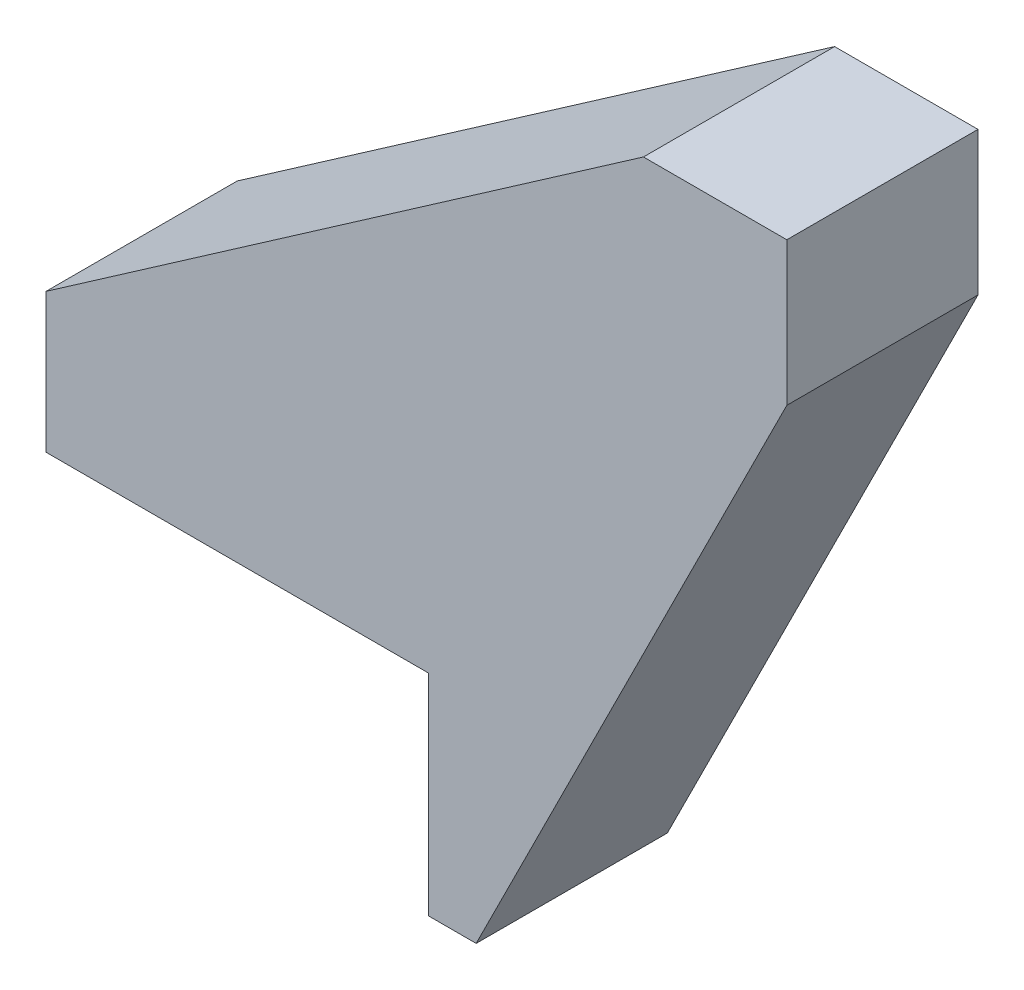
ISO-10303-21;
HEADER;
FILE_DESCRIPTION(('STEP AP214'),'2;1');
FILE_NAME('part.step','',(''),(''),'','','');
FILE_SCHEMA(('AUTOMOTIVE_DESIGN { 1 0 10303 214 1 1 1 1 }'));
ENDSEC;
DATA;
#1=APPLICATION_CONTEXT('core data for automotive mechanical design processes');
#2=APPLICATION_PROTOCOL_DEFINITION('international standard','automotive_design',2000,#1);
#3=PRODUCT_CONTEXT('',#1,'mechanical');
#4=PRODUCT('Part','Part','',(#3));
#5=PRODUCT_RELATED_PRODUCT_CATEGORY('part','',(#4));
#6=PRODUCT_DEFINITION_FORMATION('','',#4);
#7=PRODUCT_DEFINITION_CONTEXT('part definition',#1,'design');
#8=PRODUCT_DEFINITION('design','',#6,#7);
#9=PRODUCT_DEFINITION_SHAPE('','',#8);
#10=(LENGTH_UNIT() NAMED_UNIT(*) SI_UNIT(.MILLI.,.METRE.));
#11=(NAMED_UNIT(*) PLANE_ANGLE_UNIT() SI_UNIT($,.RADIAN.));
#12=(NAMED_UNIT(*) SI_UNIT($,.STERADIAN.) SOLID_ANGLE_UNIT());
#13=UNCERTAINTY_MEASURE_WITH_UNIT(LENGTH_MEASURE(1.E-05),#10,'distance_accuracy_value','');
#14=(GEOMETRIC_REPRESENTATION_CONTEXT(3) GLOBAL_UNCERTAINTY_ASSIGNED_CONTEXT((#13)) GLOBAL_UNIT_ASSIGNED_CONTEXT((#10,
#11,#12)) REPRESENTATION_CONTEXT('',''));
#15=CARTESIAN_POINT('',(0.,0.,0.));
#16=DIRECTION('',(0.,0.,1.));
#17=DIRECTION('',(1.,0.,0.));
#18=AXIS2_PLACEMENT_3D('',#15,#16,#17);
#19=CARTESIAN_POINT('',(-25.4,0.,12.7));
#20=DIRECTION('',(0.,1.,0.));
#21=DIRECTION('',(0.,0.,1.));
#22=AXIS2_PLACEMENT_3D('',#19,#20,#21);
#23=PLANE('',#22);
#24=DIRECTION('',(1.,0.,0.));
#25=VECTOR('',#24,1.);
#26=CARTESIAN_POINT('',(-25.4,0.,0.));
#27=LINE('',#26,#25);
#28=CARTESIAN_POINT('',(-25.4,0.,0.));
#29=VERTEX_POINT('',#28);
#30=CARTESIAN_POINT('',(0.,0.,0.));
#31=VERTEX_POINT('',#30);
#32=EDGE_CURVE('E139',#29,#31,#27,.T.);
#33=ORIENTED_EDGE('',*,*,#32,.T.);
#34=DIRECTION('',(0.,0.,-1.));
#35=VECTOR('',#34,1.);
#36=CARTESIAN_POINT('',(0.,0.,12.7));
#37=LINE('',#36,#35);
#38=CARTESIAN_POINT('',(0.,0.,12.7));
#39=VERTEX_POINT('',#38);
#40=EDGE_CURVE('E11',#39,#31,#37,.T.);
#41=ORIENTED_EDGE('',*,*,#40,.F.);
#42=DIRECTION('',(1.,0.,0.));
#43=VECTOR('',#42,1.);
#44=CARTESIAN_POINT('',(-25.4,0.,12.7));
#45=LINE('',#44,#43);
#46=CARTESIAN_POINT('',(-25.4,0.,12.7));
#47=VERTEX_POINT('',#46);
#48=EDGE_CURVE('E153',#47,#39,#45,.T.);
#49=ORIENTED_EDGE('',*,*,#48,.F.);
#50=DIRECTION('',(0.,0.,-1.));
#51=VECTOR('',#50,1.);
#52=CARTESIAN_POINT('',(-25.4,0.,12.7));
#53=LINE('',#52,#51);
#54=EDGE_CURVE('E135',#47,#29,#53,.T.);
#55=ORIENTED_EDGE('',*,*,#54,.T.);
#56=EDGE_LOOP('',(#33,#41,#49,#55));
#57=FACE_BOUND('',#56,.T.);
#58=ADVANCED_FACE('F43',(#57),#23,.F.);
#59=CARTESIAN_POINT('',(0.,0.,12.7));
#60=DIRECTION('',(1.,0.,0.));
#61=DIRECTION('',(0.,1.,0.));
#62=AXIS2_PLACEMENT_3D('',#59,#60,#61);
#63=PLANE('',#62);
#64=DIRECTION('',(0.,-1.,0.));
#65=VECTOR('',#64,1.);
#66=CARTESIAN_POINT('',(0.,0.,0.));
#67=LINE('',#66,#65);
#68=CARTESIAN_POINT('',(0.,-13.97,0.));
#69=VERTEX_POINT('',#68);
#70=EDGE_CURVE('E142',#31,#69,#67,.T.);
#71=ORIENTED_EDGE('',*,*,#70,.T.);
#72=DIRECTION('',(0.,0.,-1.));
#73=VECTOR('',#72,1.);
#74=CARTESIAN_POINT('',(0.,-13.97,12.7));
#75=LINE('',#74,#73);
#76=CARTESIAN_POINT('',(0.,-13.97,12.7));
#77=VERTEX_POINT('',#76);
#78=EDGE_CURVE('E51',#77,#69,#75,.T.);
#79=ORIENTED_EDGE('',*,*,#78,.F.);
#80=DIRECTION('',(0.,-1.,0.));
#81=VECTOR('',#80,1.);
#82=CARTESIAN_POINT('',(0.,0.,12.7));
#83=LINE('',#82,#81);
#84=EDGE_CURVE('E102',#39,#77,#83,.T.);
#85=ORIENTED_EDGE('',*,*,#84,.F.);
#86=ORIENTED_EDGE('',*,*,#40,.T.);
#87=EDGE_LOOP('',(#71,#79,#85,#86));
#88=FACE_BOUND('',#87,.T.);
#89=ADVANCED_FACE('F188',(#88),#63,.F.);
#90=CARTESIAN_POINT('',(0.,-13.97,12.7));
#91=DIRECTION('',(0.,1.,0.));
#92=DIRECTION('',(0.,0.,1.));
#93=AXIS2_PLACEMENT_3D('',#90,#91,#92);
#94=PLANE('',#93);
#95=DIRECTION('',(1.,0.,0.));
#96=VECTOR('',#95,1.);
#97=CARTESIAN_POINT('',(0.,-13.97,0.));
#98=LINE('',#97,#96);
#99=CARTESIAN_POINT('',(3.175,-13.97,0.));
#100=VERTEX_POINT('',#99);
#101=EDGE_CURVE('E144',#69,#100,#98,.T.);
#102=ORIENTED_EDGE('',*,*,#101,.T.);
#103=DIRECTION('',(0.,0.,-1.));
#104=VECTOR('',#103,1.);
#105=CARTESIAN_POINT('',(3.175,-13.97,12.7));
#106=LINE('',#105,#104);
#107=CARTESIAN_POINT('',(3.175,-13.97,12.7));
#108=VERTEX_POINT('',#107);
#109=EDGE_CURVE('E160',#108,#100,#106,.T.);
#110=ORIENTED_EDGE('',*,*,#109,.F.);
#111=DIRECTION('',(1.,0.,0.));
#112=VECTOR('',#111,1.);
#113=CARTESIAN_POINT('',(0.,-13.97,12.7));
#114=LINE('',#113,#112);
#115=EDGE_CURVE('E168',#77,#108,#114,.T.);
#116=ORIENTED_EDGE('',*,*,#115,.F.);
#117=ORIENTED_EDGE('',*,*,#78,.T.);
#118=EDGE_LOOP('',(#102,#110,#116,#117));
#119=FACE_BOUND('',#118,.T.);
#120=ADVANCED_FACE('F166',(#119),#94,.F.);
#121=CARTESIAN_POINT('',(3.175,-13.97,12.7));
#122=DIRECTION('',(-0.894433295877932,0.447201385535577,0.));
#123=DIRECTION('',(-0.447201385535577,-0.894433295877932,0.));
#124=AXIS2_PLACEMENT_3D('',#121,#122,#123);
#125=PLANE('',#124);
#126=DIRECTION('',(0.447201385535577,0.894433295877932,0.));
#127=VECTOR('',#126,1.);
#128=CARTESIAN_POINT('',(3.175,-13.97,0.));
#129=LINE('',#128,#127);
#130=CARTESIAN_POINT('',(23.8117956929233,27.305,0.));
#131=VERTEX_POINT('',#130);
#132=EDGE_CURVE('E146',#100,#131,#129,.T.);
#133=ORIENTED_EDGE('',*,*,#132,.T.);
#134=DIRECTION('',(0.,0.,-1.));
#135=VECTOR('',#134,1.);
#136=CARTESIAN_POINT('',(23.8117956929233,27.305,12.7));
#137=LINE('',#136,#135);
#138=CARTESIAN_POINT('',(23.8117956929233,27.305,12.7));
#139=VERTEX_POINT('',#138);
#140=EDGE_CURVE('E157',#139,#131,#137,.T.);
#141=ORIENTED_EDGE('',*,*,#140,.F.);
#142=DIRECTION('',(0.447201385535577,0.894433295877932,0.));
#143=VECTOR('',#142,1.);
#144=CARTESIAN_POINT('',(3.175,-13.97,12.7));
#145=LINE('',#144,#143);
#146=EDGE_CURVE('E180',#108,#139,#145,.T.);
#147=ORIENTED_EDGE('',*,*,#146,.F.);
#148=ORIENTED_EDGE('',*,*,#109,.T.);
#149=EDGE_LOOP('',(#133,#141,#147,#148));
#150=FACE_BOUND('',#149,.T.);
#151=ADVANCED_FACE('F176',(#150),#125,.F.);
#152=CARTESIAN_POINT('',(23.8117956929233,27.305,12.7));
#153=DIRECTION('',(-1.,0.,0.));
#154=DIRECTION('',(0.,0.,1.));
#155=AXIS2_PLACEMENT_3D('',#152,#153,#154);
#156=PLANE('',#155);
#157=DIRECTION('',(0.,1.,0.));
#158=VECTOR('',#157,1.);
#159=CARTESIAN_POINT('',(23.8117956929233,27.305,0.));
#160=LINE('',#159,#158);
#161=CARTESIAN_POINT('',(23.8117956929233,36.83,0.));
#162=VERTEX_POINT('',#161);
#163=EDGE_CURVE('E148',#131,#162,#160,.T.);
#164=ORIENTED_EDGE('',*,*,#163,.T.);
#165=DIRECTION('',(0.,0.,-1.));
#166=VECTOR('',#165,1.);
#167=CARTESIAN_POINT('',(23.8117956929233,36.83,12.7));
#168=LINE('',#167,#166);
#169=CARTESIAN_POINT('',(23.8117956929233,36.83,12.7));
#170=VERTEX_POINT('',#169);
#171=EDGE_CURVE('E130',#170,#162,#168,.T.);
#172=ORIENTED_EDGE('',*,*,#171,.F.);
#173=DIRECTION('',(0.,1.,0.));
#174=VECTOR('',#173,1.);
#175=CARTESIAN_POINT('',(23.8117956929233,27.305,12.7));
#176=LINE('',#175,#174);
#177=EDGE_CURVE('E121',#139,#170,#176,.T.);
#178=ORIENTED_EDGE('',*,*,#177,.F.);
#179=ORIENTED_EDGE('',*,*,#140,.T.);
#180=EDGE_LOOP('',(#164,#172,#178,#179));
#181=FACE_BOUND('',#180,.T.);
#182=ADVANCED_FACE('F179',(#181),#156,.F.);
#183=CARTESIAN_POINT('',(23.8117956929233,36.83,12.7));
#184=DIRECTION('',(0.,-1.,0.));
#185=DIRECTION('',(0.,0.,-1.));
#186=AXIS2_PLACEMENT_3D('',#183,#184,#185);
#187=PLANE('',#186);
#188=DIRECTION('',(-1.,0.,0.));
#189=VECTOR('',#188,1.);
#190=CARTESIAN_POINT('',(23.8117956929233,36.83,0.));
#191=LINE('',#190,#189);
#192=CARTESIAN_POINT('',(14.2867956929233,36.83,0.));
#193=VERTEX_POINT('',#192);
#194=EDGE_CURVE('E129',#162,#193,#191,.T.);
#195=ORIENTED_EDGE('',*,*,#194,.T.);
#196=DIRECTION('',(0.,0.,-1.));
#197=VECTOR('',#196,1.);
#198=CARTESIAN_POINT('',(14.2867956929233,36.83,12.7));
#199=LINE('',#198,#197);
#200=CARTESIAN_POINT('',(14.2867956929233,36.83,12.7));
#201=VERTEX_POINT('',#200);
#202=EDGE_CURVE('E126',#201,#193,#199,.T.);
#203=ORIENTED_EDGE('',*,*,#202,.F.);
#204=DIRECTION('',(-1.,0.,0.));
#205=VECTOR('',#204,1.);
#206=CARTESIAN_POINT('',(23.8117956929233,36.83,12.7));
#207=LINE('',#206,#205);
#208=EDGE_CURVE('E115',#170,#201,#207,.T.);
#209=ORIENTED_EDGE('',*,*,#208,.F.);
#210=ORIENTED_EDGE('',*,*,#171,.T.);
#211=EDGE_LOOP('',(#195,#203,#209,#210));
#212=FACE_BOUND('',#211,.T.);
#213=ADVANCED_FACE('F127',(#212),#187,.F.);
#214=CARTESIAN_POINT('',(14.2867956929233,36.83,12.7));
#215=DIRECTION('',(0.57060398779713,-0.821225358296986,0.));
#216=DIRECTION('',(0.821225358296986,0.57060398779713,0.));
#217=AXIS2_PLACEMENT_3D('',#214,#215,#216);
#218=PLANE('',#217);
#219=DIRECTION('',(-0.821225358296986,-0.57060398779713,0.));
#220=VECTOR('',#219,1.);
#221=CARTESIAN_POINT('',(14.2867956929233,36.83,0.));
#222=LINE('',#221,#220);
#223=CARTESIAN_POINT('',(-25.4,9.25481170791782,0.));
#224=VERTEX_POINT('',#223);
#225=EDGE_CURVE('E88',#193,#224,#222,.T.);
#226=ORIENTED_EDGE('',*,*,#225,.T.);
#227=DIRECTION('',(0.,0.,-1.));
#228=VECTOR('',#227,1.);
#229=CARTESIAN_POINT('',(-25.4,9.25481170791782,12.7));
#230=LINE('',#229,#228);
#231=CARTESIAN_POINT('',(-25.4,9.25481170791782,12.7));
#232=VERTEX_POINT('',#231);
#233=EDGE_CURVE('E131',#232,#224,#230,.T.);
#234=ORIENTED_EDGE('',*,*,#233,.F.);
#235=DIRECTION('',(-0.821225358296986,-0.57060398779713,0.));
#236=VECTOR('',#235,1.);
#237=CARTESIAN_POINT('',(14.2867956929233,36.83,12.7));
#238=LINE('',#237,#236);
#239=EDGE_CURVE('E119',#201,#232,#238,.T.);
#240=ORIENTED_EDGE('',*,*,#239,.F.);
#241=ORIENTED_EDGE('',*,*,#202,.T.);
#242=EDGE_LOOP('',(#226,#234,#240,#241));
#243=FACE_BOUND('',#242,.T.);
#244=ADVANCED_FACE('F133',(#243),#218,.F.);
#245=CARTESIAN_POINT('',(-25.4,9.25481170791782,12.7));
#246=DIRECTION('',(1.,0.,0.));
#247=DIRECTION('',(0.,0.,-1.));
#248=AXIS2_PLACEMENT_3D('',#245,#246,#247);
#249=PLANE('',#248);
#250=DIRECTION('',(0.,-1.,0.));
#251=VECTOR('',#250,1.);
#252=CARTESIAN_POINT('',(-25.4,9.25481170791782,0.));
#253=LINE('',#252,#251);
#254=EDGE_CURVE('E94',#224,#29,#253,.T.);
#255=ORIENTED_EDGE('',*,*,#254,.T.);
#256=ORIENTED_EDGE('',*,*,#54,.F.);
#257=DIRECTION('',(0.,-1.,0.));
#258=VECTOR('',#257,1.);
#259=CARTESIAN_POINT('',(-25.4,9.25481170791782,12.7));
#260=LINE('',#259,#258);
#261=EDGE_CURVE('E59',#232,#47,#260,.T.);
#262=ORIENTED_EDGE('',*,*,#261,.F.);
#263=ORIENTED_EDGE('',*,*,#233,.T.);
#264=EDGE_LOOP('',(#255,#256,#262,#263));
#265=FACE_BOUND('',#264,.T.);
#266=ADVANCED_FACE('F204',(#265),#249,.F.);
#267=CARTESIAN_POINT('',(0.,0.,12.7));
#268=DIRECTION('',(0.,0.,-1.));
#269=DIRECTION('',(-1.,0.,0.));
#270=AXIS2_PLACEMENT_3D('',#267,#268,#269);
#271=PLANE('',#270);
#272=ORIENTED_EDGE('',*,*,#48,.T.);
#273=ORIENTED_EDGE('',*,*,#84,.T.);
#274=ORIENTED_EDGE('',*,*,#115,.T.);
#275=ORIENTED_EDGE('',*,*,#146,.T.);
#276=ORIENTED_EDGE('',*,*,#177,.T.);
#277=ORIENTED_EDGE('',*,*,#208,.T.);
#278=ORIENTED_EDGE('',*,*,#239,.T.);
#279=ORIENTED_EDGE('',*,*,#261,.T.);
#280=EDGE_LOOP('',(#272,#273,#274,#275,#276,#277,#278,#279));
#281=FACE_BOUND('',#280,.T.);
#282=ADVANCED_FACE('F117',(#281),#271,.F.);
#283=CARTESIAN_POINT('',(0.,0.,0.));
#284=DIRECTION('',(0.,0.,-1.));
#285=DIRECTION('',(-1.,0.,0.));
#286=AXIS2_PLACEMENT_3D('',#283,#284,#285);
#287=PLANE('',#286);
#288=ORIENTED_EDGE('',*,*,#32,.F.);
#289=ORIENTED_EDGE('',*,*,#254,.F.);
#290=ORIENTED_EDGE('',*,*,#225,.F.);
#291=ORIENTED_EDGE('',*,*,#194,.F.);
#292=ORIENTED_EDGE('',*,*,#163,.F.);
#293=ORIENTED_EDGE('',*,*,#132,.F.);
#294=ORIENTED_EDGE('',*,*,#101,.F.);
#295=ORIENTED_EDGE('',*,*,#70,.F.);
#296=EDGE_LOOP('',(#288,#289,#290,#291,#292,#293,#294,#295));
#297=FACE_BOUND('',#296,.T.);
#298=ADVANCED_FACE('F172',(#297),#287,.T.);
#299=CLOSED_SHELL('',(#58,#89,#120,#151,#182,#213,#244,#266,#282,#298));
#300=MANIFOLD_SOLID_BREP('B2',#299);
#301=ADVANCED_BREP_SHAPE_REPRESENTATION('',(#18,#300),#14);
#302=SHAPE_DEFINITION_REPRESENTATION(#9,#301);
ENDSEC;
END-ISO-10303-21;
